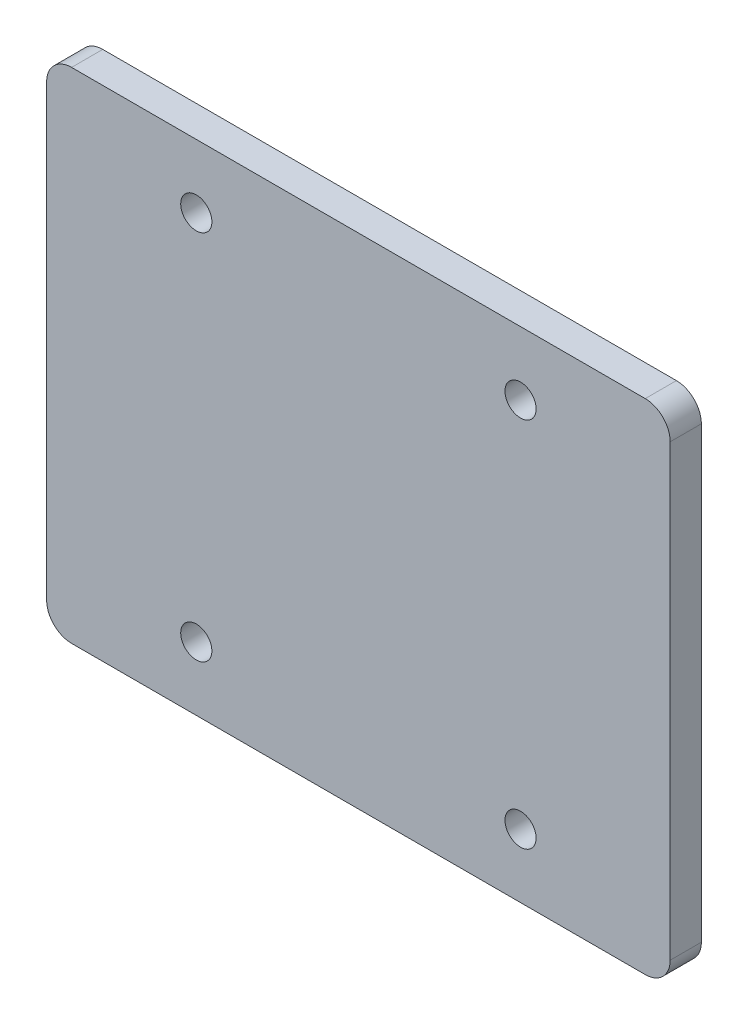
ISO-10303-21;
HEADER;
FILE_DESCRIPTION(('STEP AP214'),'2;1');
FILE_NAME('part.step','',(''),(''),'','','');
FILE_SCHEMA(('AUTOMOTIVE_DESIGN { 1 0 10303 214 1 1 1 1 }'));
ENDSEC;
DATA;
#1=APPLICATION_CONTEXT('core data for automotive mechanical design processes');
#2=APPLICATION_PROTOCOL_DEFINITION('international standard','automotive_design',2000,#1);
#3=PRODUCT_CONTEXT('',#1,'mechanical');
#4=PRODUCT('Part','Part','',(#3));
#5=PRODUCT_RELATED_PRODUCT_CATEGORY('part','',(#4));
#6=PRODUCT_DEFINITION_FORMATION('','',#4);
#7=PRODUCT_DEFINITION_CONTEXT('part definition',#1,'design');
#8=PRODUCT_DEFINITION('design','',#6,#7);
#9=PRODUCT_DEFINITION_SHAPE('','',#8);
#10=(LENGTH_UNIT() NAMED_UNIT(*) SI_UNIT(.MILLI.,.METRE.));
#11=(NAMED_UNIT(*) PLANE_ANGLE_UNIT() SI_UNIT($,.RADIAN.));
#12=(NAMED_UNIT(*) SI_UNIT($,.STERADIAN.) SOLID_ANGLE_UNIT());
#13=UNCERTAINTY_MEASURE_WITH_UNIT(LENGTH_MEASURE(1.E-05),#10,'distance_accuracy_value','');
#14=(GEOMETRIC_REPRESENTATION_CONTEXT(3) GLOBAL_UNCERTAINTY_ASSIGNED_CONTEXT((#13)) GLOBAL_UNIT_ASSIGNED_CONTEXT((#10,
#11,#12)) REPRESENTATION_CONTEXT('',''));
#15=CARTESIAN_POINT('',(0.,0.,0.));
#16=DIRECTION('',(0.,0.,1.));
#17=DIRECTION('',(1.,0.,0.));
#18=AXIS2_PLACEMENT_3D('',#15,#16,#17);
#19=CARTESIAN_POINT('',(0.,0.,3.175));
#20=DIRECTION('',(1.,0.,0.));
#21=DIRECTION('',(0.,1.,0.));
#22=AXIS2_PLACEMENT_3D('',#19,#20,#21);
#23=PLANE('',#22);
#24=DIRECTION('',(0.,-1.,0.));
#25=VECTOR('',#24,1.);
#26=CARTESIAN_POINT('',(0.,0.,0.));
#27=LINE('',#26,#25);
#28=CARTESIAN_POINT('',(0.,48.26,0.));
#29=VERTEX_POINT('',#28);
#30=CARTESIAN_POINT('',(0.,2.54,0.));
#31=VERTEX_POINT('',#30);
#32=EDGE_CURVE('E126',#29,#31,#27,.T.);
#33=ORIENTED_EDGE('',*,*,#32,.T.);
#34=DIRECTION('',(0.,0.,-1.));
#35=VECTOR('',#34,1.);
#36=CARTESIAN_POINT('',(0.,2.54,3.175));
#37=LINE('',#36,#35);
#38=CARTESIAN_POINT('',(0.,2.54,3.175));
#39=VERTEX_POINT('',#38);
#40=EDGE_CURVE('E104',#31,#39,#37,.F.);
#41=ORIENTED_EDGE('',*,*,#40,.T.);
#42=DIRECTION('',(0.,-1.,0.));
#43=VECTOR('',#42,1.);
#44=CARTESIAN_POINT('',(0.,0.,3.175));
#45=LINE('',#44,#43);
#46=CARTESIAN_POINT('',(0.,48.26,3.175));
#47=VERTEX_POINT('',#46);
#48=EDGE_CURVE('E136',#47,#39,#45,.T.);
#49=ORIENTED_EDGE('',*,*,#48,.F.);
#50=DIRECTION('',(0.,0.,-1.));
#51=VECTOR('',#50,1.);
#52=CARTESIAN_POINT('',(0.,48.26,3.175));
#53=LINE('',#52,#51);
#54=EDGE_CURVE('E109',#47,#29,#53,.T.);
#55=ORIENTED_EDGE('',*,*,#54,.T.);
#56=EDGE_LOOP('',(#33,#41,#49,#55));
#57=FACE_BOUND('',#56,.T.);
#58=ADVANCED_FACE('F34',(#57),#23,.F.);
#59=CARTESIAN_POINT('',(0.,0.,3.175));
#60=DIRECTION('',(0.,1.,0.));
#61=DIRECTION('',(0.,0.,1.));
#62=AXIS2_PLACEMENT_3D('',#59,#60,#61);
#63=PLANE('',#62);
#64=DIRECTION('',(1.,0.,0.));
#65=VECTOR('',#64,1.);
#66=CARTESIAN_POINT('',(0.,0.,3.175));
#67=LINE('',#66,#65);
#68=CARTESIAN_POINT('',(2.54,0.,3.175));
#69=VERTEX_POINT('',#68);
#70=CARTESIAN_POINT('',(60.96,0.,3.175));
#71=VERTEX_POINT('',#70);
#72=EDGE_CURVE('E119',#69,#71,#67,.T.);
#73=ORIENTED_EDGE('',*,*,#72,.F.);
#74=DIRECTION('',(0.,0.,-1.));
#75=VECTOR('',#74,1.);
#76=CARTESIAN_POINT('',(2.54,0.,3.175));
#77=LINE('',#76,#75);
#78=CARTESIAN_POINT('',(2.54,0.,0.));
#79=VERTEX_POINT('',#78);
#80=EDGE_CURVE('E103',#69,#79,#77,.T.);
#81=ORIENTED_EDGE('',*,*,#80,.T.);
#82=DIRECTION('',(1.,0.,0.));
#83=VECTOR('',#82,1.);
#84=CARTESIAN_POINT('',(0.,0.,0.));
#85=LINE('',#84,#83);
#86=CARTESIAN_POINT('',(60.96,0.,0.));
#87=VERTEX_POINT('',#86);
#88=EDGE_CURVE('E116',#79,#87,#85,.T.);
#89=ORIENTED_EDGE('',*,*,#88,.T.);
#90=DIRECTION('',(0.,0.,-1.));
#91=VECTOR('',#90,1.);
#92=CARTESIAN_POINT('',(60.96,0.,3.175));
#93=LINE('',#92,#91);
#94=EDGE_CURVE('E121',#87,#71,#93,.F.);
#95=ORIENTED_EDGE('',*,*,#94,.T.);
#96=EDGE_LOOP('',(#73,#81,#89,#95));
#97=FACE_BOUND('',#96,.T.);
#98=ADVANCED_FACE('F115',(#97),#63,.F.);
#99=CARTESIAN_POINT('',(63.5,0.,3.175));
#100=DIRECTION('',(-1.,0.,0.));
#101=DIRECTION('',(0.,-1.,0.));
#102=AXIS2_PLACEMENT_3D('',#99,#100,#101);
#103=PLANE('',#102);
#104=DIRECTION('',(0.,1.,0.));
#105=VECTOR('',#104,1.);
#106=CARTESIAN_POINT('',(63.5,0.,3.175));
#107=LINE('',#106,#105);
#108=CARTESIAN_POINT('',(63.5,2.54,3.175));
#109=VERTEX_POINT('',#108);
#110=CARTESIAN_POINT('',(63.5,48.26,3.175));
#111=VERTEX_POINT('',#110);
#112=EDGE_CURVE('E170',#109,#111,#107,.T.);
#113=ORIENTED_EDGE('',*,*,#112,.F.);
#114=DIRECTION('',(0.,0.,-1.));
#115=VECTOR('',#114,1.);
#116=CARTESIAN_POINT('',(63.5,2.54,3.175));
#117=LINE('',#116,#115);
#118=CARTESIAN_POINT('',(63.5,2.54,0.));
#119=VERTEX_POINT('',#118);
#120=EDGE_CURVE('E155',#109,#119,#117,.T.);
#121=ORIENTED_EDGE('',*,*,#120,.T.);
#122=DIRECTION('',(0.,1.,0.));
#123=VECTOR('',#122,1.);
#124=CARTESIAN_POINT('',(63.5,0.,0.));
#125=LINE('',#124,#123);
#126=CARTESIAN_POINT('',(63.5,48.26,0.));
#127=VERTEX_POINT('',#126);
#128=EDGE_CURVE('E125',#119,#127,#125,.T.);
#129=ORIENTED_EDGE('',*,*,#128,.T.);
#130=DIRECTION('',(0.,0.,-1.));
#131=VECTOR('',#130,1.);
#132=CARTESIAN_POINT('',(63.5,48.26,3.175));
#133=LINE('',#132,#131);
#134=EDGE_CURVE('E153',#127,#111,#133,.F.);
#135=ORIENTED_EDGE('',*,*,#134,.T.);
#136=EDGE_LOOP('',(#113,#121,#129,#135));
#137=FACE_BOUND('',#136,.T.);
#138=ADVANCED_FACE('F185',(#137),#103,.F.);
#139=CARTESIAN_POINT('',(0.,50.8,3.175));
#140=DIRECTION('',(0.,-1.,0.));
#141=DIRECTION('',(0.,0.,-1.));
#142=AXIS2_PLACEMENT_3D('',#139,#140,#141);
#143=PLANE('',#142);
#144=DIRECTION('',(-1.,0.,0.));
#145=VECTOR('',#144,1.);
#146=CARTESIAN_POINT('',(0.,50.8,0.));
#147=LINE('',#146,#145);
#148=CARTESIAN_POINT('',(60.96,50.8,0.));
#149=VERTEX_POINT('',#148);
#150=CARTESIAN_POINT('',(2.53999999999999,50.8,0.));
#151=VERTEX_POINT('',#150);
#152=EDGE_CURVE('E129',#149,#151,#147,.T.);
#153=ORIENTED_EDGE('',*,*,#152,.T.);
#154=DIRECTION('',(0.,0.,-1.));
#155=VECTOR('',#154,1.);
#156=CARTESIAN_POINT('',(2.53999999999999,50.8,3.175));
#157=LINE('',#156,#155);
#158=CARTESIAN_POINT('',(2.53999999999999,50.8,3.175));
#159=VERTEX_POINT('',#158);
#160=EDGE_CURVE('E11',#151,#159,#157,.F.);
#161=ORIENTED_EDGE('',*,*,#160,.T.);
#162=DIRECTION('',(-1.,0.,0.));
#163=VECTOR('',#162,1.);
#164=CARTESIAN_POINT('',(0.,50.8,3.175));
#165=LINE('',#164,#163);
#166=CARTESIAN_POINT('',(60.96,50.8,3.175));
#167=VERTEX_POINT('',#166);
#168=EDGE_CURVE('E137',#167,#159,#165,.T.);
#169=ORIENTED_EDGE('',*,*,#168,.F.);
#170=DIRECTION('',(0.,0.,-1.));
#171=VECTOR('',#170,1.);
#172=CARTESIAN_POINT('',(60.96,50.8,3.175));
#173=LINE('',#172,#171);
#174=EDGE_CURVE('E42',#167,#149,#173,.T.);
#175=ORIENTED_EDGE('',*,*,#174,.T.);
#176=EDGE_LOOP('',(#153,#161,#169,#175));
#177=FACE_BOUND('',#176,.T.);
#178=ADVANCED_FACE('F160',(#177),#143,.F.);
#179=CARTESIAN_POINT('',(0.,0.,3.175));
#180=DIRECTION('',(0.,0.,-1.));
#181=DIRECTION('',(-1.,0.,0.));
#182=AXIS2_PLACEMENT_3D('',#179,#180,#181);
#183=PLANE('',#182);
#184=CARTESIAN_POINT('',(48.26,6.477,3.175));
#185=DIRECTION('',(0.,0.,-1.));
#186=DIRECTION('',(-1.,0.,0.));
#187=AXIS2_PLACEMENT_3D('',#184,#185,#186);
#188=CIRCLE('',#187,1.5875);
#189=CARTESIAN_POINT('',(46.6725,6.477,3.175));
#190=VERTEX_POINT('',#189);
#191=EDGE_CURVE('E301',#190,#190,#188,.T.);
#192=ORIENTED_EDGE('',*,*,#191,.T.);
#193=EDGE_LOOP('',(#192));
#194=FACE_BOUND('',#193,.T.);
#195=CARTESIAN_POINT('',(48.26,44.323,3.175));
#196=DIRECTION('',(0.,0.,-1.));
#197=DIRECTION('',(-1.,0.,0.));
#198=AXIS2_PLACEMENT_3D('',#195,#196,#197);
#199=CIRCLE('',#198,1.5875);
#200=CARTESIAN_POINT('',(46.6725,44.323,3.175));
#201=VERTEX_POINT('',#200);
#202=EDGE_CURVE('E303',#201,#201,#199,.T.);
#203=ORIENTED_EDGE('',*,*,#202,.T.);
#204=EDGE_LOOP('',(#203));
#205=FACE_BOUND('',#204,.T.);
#206=CARTESIAN_POINT('',(15.24,44.323,3.175));
#207=DIRECTION('',(0.,0.,-1.));
#208=DIRECTION('',(-1.,0.,0.));
#209=AXIS2_PLACEMENT_3D('',#206,#207,#208);
#210=CIRCLE('',#209,1.5875);
#211=CARTESIAN_POINT('',(13.6525,44.323,3.175));
#212=VERTEX_POINT('',#211);
#213=EDGE_CURVE('E315',#212,#212,#210,.T.);
#214=ORIENTED_EDGE('',*,*,#213,.T.);
#215=EDGE_LOOP('',(#214));
#216=FACE_BOUND('',#215,.T.);
#217=CARTESIAN_POINT('',(15.24,6.477,3.175));
#218=DIRECTION('',(0.,0.,-1.));
#219=DIRECTION('',(-1.,0.,0.));
#220=AXIS2_PLACEMENT_3D('',#217,#218,#219);
#221=CIRCLE('',#220,1.5875);
#222=CARTESIAN_POINT('',(13.6525,6.477,3.175));
#223=VERTEX_POINT('',#222);
#224=EDGE_CURVE('E308',#223,#223,#221,.T.);
#225=ORIENTED_EDGE('',*,*,#224,.T.);
#226=EDGE_LOOP('',(#225));
#227=FACE_BOUND('',#226,.T.);
#228=ORIENTED_EDGE('',*,*,#48,.T.);
#229=CARTESIAN_POINT('',(2.54,2.54,3.175));
#230=DIRECTION('',(0.,0.,-1.));
#231=DIRECTION('',(-1.,0.,0.));
#232=AXIS2_PLACEMENT_3D('',#229,#230,#231);
#233=CIRCLE('',#232,2.54);
#234=EDGE_CURVE('E151',#39,#69,#233,.F.);
#235=ORIENTED_EDGE('',*,*,#234,.T.);
#236=ORIENTED_EDGE('',*,*,#72,.T.);
#237=CARTESIAN_POINT('',(60.96,2.54,3.175));
#238=DIRECTION('',(0.,0.,-1.));
#239=DIRECTION('',(-1.,0.,0.));
#240=AXIS2_PLACEMENT_3D('',#237,#238,#239);
#241=CIRCLE('',#240,2.54);
#242=EDGE_CURVE('E149',#71,#109,#241,.F.);
#243=ORIENTED_EDGE('',*,*,#242,.T.);
#244=ORIENTED_EDGE('',*,*,#112,.T.);
#245=CARTESIAN_POINT('',(60.96,48.26,3.175));
#246=DIRECTION('',(0.,0.,-1.));
#247=DIRECTION('',(-1.,0.,0.));
#248=AXIS2_PLACEMENT_3D('',#245,#246,#247);
#249=CIRCLE('',#248,2.54);
#250=EDGE_CURVE('E54',#111,#167,#249,.F.);
#251=ORIENTED_EDGE('',*,*,#250,.T.);
#252=ORIENTED_EDGE('',*,*,#168,.T.);
#253=CARTESIAN_POINT('',(2.53999999999999,48.26,3.175));
#254=DIRECTION('',(0.,0.,-1.));
#255=DIRECTION('',(-1.,0.,0.));
#256=AXIS2_PLACEMENT_3D('',#253,#254,#255);
#257=CIRCLE('',#256,2.54);
#258=EDGE_CURVE('E147',#159,#47,#257,.F.);
#259=ORIENTED_EDGE('',*,*,#258,.T.);
#260=EDGE_LOOP('',(#228,#235,#236,#243,#244,#251,#252,#259));
#261=FACE_BOUND('',#260,.T.);
#262=ADVANCED_FACE('F175',(#194,#205,#216,#227,#261),#183,.F.);
#263=CARTESIAN_POINT('',(0.,0.,0.));
#264=DIRECTION('',(0.,0.,-1.));
#265=DIRECTION('',(-1.,0.,0.));
#266=AXIS2_PLACEMENT_3D('',#263,#264,#265);
#267=PLANE('',#266);
#268=CARTESIAN_POINT('',(48.26,6.477,0.));
#269=DIRECTION('',(0.,0.,-1.));
#270=DIRECTION('',(-1.,0.,0.));
#271=AXIS2_PLACEMENT_3D('',#268,#269,#270);
#272=CIRCLE('',#271,1.5875);
#273=CARTESIAN_POINT('',(46.6725,6.477,0.));
#274=VERTEX_POINT('',#273);
#275=EDGE_CURVE('E299',#274,#274,#272,.T.);
#276=ORIENTED_EDGE('',*,*,#275,.F.);
#277=EDGE_LOOP('',(#276));
#278=FACE_BOUND('',#277,.T.);
#279=CARTESIAN_POINT('',(48.26,44.323,0.));
#280=DIRECTION('',(0.,0.,-1.));
#281=DIRECTION('',(-1.,0.,0.));
#282=AXIS2_PLACEMENT_3D('',#279,#280,#281);
#283=CIRCLE('',#282,1.5875);
#284=CARTESIAN_POINT('',(46.6725,44.323,0.));
#285=VERTEX_POINT('',#284);
#286=EDGE_CURVE('E306',#285,#285,#283,.T.);
#287=ORIENTED_EDGE('',*,*,#286,.F.);
#288=EDGE_LOOP('',(#287));
#289=FACE_BOUND('',#288,.T.);
#290=CARTESIAN_POINT('',(15.24,44.323,0.));
#291=DIRECTION('',(0.,0.,-1.));
#292=DIRECTION('',(-1.,0.,0.));
#293=AXIS2_PLACEMENT_3D('',#290,#291,#292);
#294=CIRCLE('',#293,1.5875);
#295=CARTESIAN_POINT('',(13.6525,44.323,0.));
#296=VERTEX_POINT('',#295);
#297=EDGE_CURVE('E310',#296,#296,#294,.T.);
#298=ORIENTED_EDGE('',*,*,#297,.F.);
#299=EDGE_LOOP('',(#298));
#300=FACE_BOUND('',#299,.T.);
#301=CARTESIAN_POINT('',(15.24,6.477,0.));
#302=DIRECTION('',(0.,0.,-1.));
#303=DIRECTION('',(-1.,0.,0.));
#304=AXIS2_PLACEMENT_3D('',#301,#302,#303);
#305=CIRCLE('',#304,1.5875);
#306=CARTESIAN_POINT('',(13.6525,6.477,0.));
#307=VERTEX_POINT('',#306);
#308=EDGE_CURVE('E131',#307,#307,#305,.T.);
#309=ORIENTED_EDGE('',*,*,#308,.F.);
#310=EDGE_LOOP('',(#309));
#311=FACE_BOUND('',#310,.T.);
#312=ORIENTED_EDGE('',*,*,#88,.F.);
#313=CARTESIAN_POINT('',(2.54,2.54,0.));
#314=DIRECTION('',(0.,0.,-1.));
#315=DIRECTION('',(-1.,0.,0.));
#316=AXIS2_PLACEMENT_3D('',#313,#314,#315);
#317=CIRCLE('',#316,2.54);
#318=EDGE_CURVE('E99',#79,#31,#317,.T.);
#319=ORIENTED_EDGE('',*,*,#318,.T.);
#320=ORIENTED_EDGE('',*,*,#32,.F.);
#321=CARTESIAN_POINT('',(2.53999999999999,48.26,0.));
#322=DIRECTION('',(0.,0.,-1.));
#323=DIRECTION('',(-1.,0.,0.));
#324=AXIS2_PLACEMENT_3D('',#321,#322,#323);
#325=CIRCLE('',#324,2.54);
#326=EDGE_CURVE('E140',#29,#151,#325,.T.);
#327=ORIENTED_EDGE('',*,*,#326,.T.);
#328=ORIENTED_EDGE('',*,*,#152,.F.);
#329=CARTESIAN_POINT('',(60.96,48.26,0.));
#330=DIRECTION('',(0.,0.,-1.));
#331=DIRECTION('',(-1.,0.,0.));
#332=AXIS2_PLACEMENT_3D('',#329,#330,#331);
#333=CIRCLE('',#332,2.54);
#334=EDGE_CURVE('E120',#149,#127,#333,.T.);
#335=ORIENTED_EDGE('',*,*,#334,.T.);
#336=ORIENTED_EDGE('',*,*,#128,.F.);
#337=CARTESIAN_POINT('',(60.96,2.54,0.));
#338=DIRECTION('',(0.,0.,-1.));
#339=DIRECTION('',(-1.,0.,0.));
#340=AXIS2_PLACEMENT_3D('',#337,#338,#339);
#341=CIRCLE('',#340,2.54);
#342=EDGE_CURVE('E110',#119,#87,#341,.T.);
#343=ORIENTED_EDGE('',*,*,#342,.T.);
#344=EDGE_LOOP('',(#312,#319,#320,#327,#328,#335,#336,#343));
#345=FACE_BOUND('',#344,.T.);
#346=ADVANCED_FACE('F123',(#278,#289,#300,#311,#345),#267,.T.);
#347=CARTESIAN_POINT('',(2.54,2.54,3.175));
#348=DIRECTION('',(0.,0.,-1.));
#349=DIRECTION('',(-1.,0.,0.));
#350=AXIS2_PLACEMENT_3D('',#347,#348,#349);
#351=CYLINDRICAL_SURFACE('',#350,2.54);
#352=ORIENTED_EDGE('',*,*,#234,.F.);
#353=ORIENTED_EDGE('',*,*,#40,.F.);
#354=ORIENTED_EDGE('',*,*,#318,.F.);
#355=ORIENTED_EDGE('',*,*,#80,.F.);
#356=EDGE_LOOP('',(#352,#353,#354,#355));
#357=FACE_BOUND('',#356,.T.);
#358=ADVANCED_FACE('F102',(#357),#351,.T.);
#359=CARTESIAN_POINT('',(60.96,2.54,3.175));
#360=DIRECTION('',(0.,0.,-1.));
#361=DIRECTION('',(-1.,0.,0.));
#362=AXIS2_PLACEMENT_3D('',#359,#360,#361);
#363=CYLINDRICAL_SURFACE('',#362,2.54);
#364=ORIENTED_EDGE('',*,*,#242,.F.);
#365=ORIENTED_EDGE('',*,*,#94,.F.);
#366=ORIENTED_EDGE('',*,*,#342,.F.);
#367=ORIENTED_EDGE('',*,*,#120,.F.);
#368=EDGE_LOOP('',(#364,#365,#366,#367));
#369=FACE_BOUND('',#368,.T.);
#370=ADVANCED_FACE('F200',(#369),#363,.T.);
#371=CARTESIAN_POINT('',(2.53999999999999,48.26,3.175));
#372=DIRECTION('',(0.,0.,-1.));
#373=DIRECTION('',(-1.,0.,0.));
#374=AXIS2_PLACEMENT_3D('',#371,#372,#373);
#375=CYLINDRICAL_SURFACE('',#374,2.54);
#376=ORIENTED_EDGE('',*,*,#258,.F.);
#377=ORIENTED_EDGE('',*,*,#160,.F.);
#378=ORIENTED_EDGE('',*,*,#326,.F.);
#379=ORIENTED_EDGE('',*,*,#54,.F.);
#380=EDGE_LOOP('',(#376,#377,#378,#379));
#381=FACE_BOUND('',#380,.T.);
#382=ADVANCED_FACE('F165',(#381),#375,.T.);
#383=CARTESIAN_POINT('',(60.96,48.26,3.175));
#384=DIRECTION('',(0.,0.,-1.));
#385=DIRECTION('',(-1.,0.,0.));
#386=AXIS2_PLACEMENT_3D('',#383,#384,#385);
#387=CYLINDRICAL_SURFACE('',#386,2.54);
#388=ORIENTED_EDGE('',*,*,#250,.F.);
#389=ORIENTED_EDGE('',*,*,#134,.F.);
#390=ORIENTED_EDGE('',*,*,#334,.F.);
#391=ORIENTED_EDGE('',*,*,#174,.F.);
#392=EDGE_LOOP('',(#388,#389,#390,#391));
#393=FACE_BOUND('',#392,.T.);
#394=ADVANCED_FACE('F36',(#393),#387,.T.);
#395=CARTESIAN_POINT('',(15.24,6.477,-0.00100000000000013));
#396=DIRECTION('',(0.,0.,1.));
#397=DIRECTION('',(1.,0.,0.));
#398=AXIS2_PLACEMENT_3D('',#395,#396,#397);
#399=CYLINDRICAL_SURFACE('',#398,1.5875);
#400=ORIENTED_EDGE('',*,*,#308,.T.);
#401=EDGE_LOOP('',(#400));
#402=FACE_BOUND('',#401,.T.);
#403=ORIENTED_EDGE('',*,*,#224,.F.);
#404=EDGE_LOOP('',(#403));
#405=FACE_BOUND('',#404,.T.);
#406=ADVANCED_FACE('F207',(#402,#405),#399,.F.);
#407=CARTESIAN_POINT('',(15.24,44.323,-0.00100000000000013));
#408=DIRECTION('',(0.,0.,1.));
#409=DIRECTION('',(1.,0.,0.));
#410=AXIS2_PLACEMENT_3D('',#407,#408,#409);
#411=CYLINDRICAL_SURFACE('',#410,1.5875);
#412=ORIENTED_EDGE('',*,*,#297,.T.);
#413=EDGE_LOOP('',(#412));
#414=FACE_BOUND('',#413,.T.);
#415=ORIENTED_EDGE('',*,*,#213,.F.);
#416=EDGE_LOOP('',(#415));
#417=FACE_BOUND('',#416,.T.);
#418=ADVANCED_FACE('F211',(#414,#417),#411,.F.);
#419=CARTESIAN_POINT('',(48.26,44.323,-0.00100000000000013));
#420=DIRECTION('',(0.,0.,1.));
#421=DIRECTION('',(1.,0.,0.));
#422=AXIS2_PLACEMENT_3D('',#419,#420,#421);
#423=CYLINDRICAL_SURFACE('',#422,1.5875);
#424=ORIENTED_EDGE('',*,*,#286,.T.);
#425=EDGE_LOOP('',(#424));
#426=FACE_BOUND('',#425,.T.);
#427=ORIENTED_EDGE('',*,*,#202,.F.);
#428=EDGE_LOOP('',(#427));
#429=FACE_BOUND('',#428,.T.);
#430=ADVANCED_FACE('F272',(#426,#429),#423,.F.);
#431=CARTESIAN_POINT('',(48.26,6.477,-0.00100000000000013));
#432=DIRECTION('',(0.,0.,1.));
#433=DIRECTION('',(1.,0.,0.));
#434=AXIS2_PLACEMENT_3D('',#431,#432,#433);
#435=CYLINDRICAL_SURFACE('',#434,1.5875);
#436=ORIENTED_EDGE('',*,*,#275,.T.);
#437=EDGE_LOOP('',(#436));
#438=FACE_BOUND('',#437,.T.);
#439=ORIENTED_EDGE('',*,*,#191,.F.);
#440=EDGE_LOOP('',(#439));
#441=FACE_BOUND('',#440,.T.);
#442=ADVANCED_FACE('F282',(#438,#441),#435,.F.);
#443=CLOSED_SHELL('',(#58,#98,#138,#178,#262,#346,#358,#370,#382,#394,#406,#418,#430,#442));
#444=MANIFOLD_SOLID_BREP('B2',#443);
#445=ADVANCED_BREP_SHAPE_REPRESENTATION('',(#18,#444),#14);
#446=SHAPE_DEFINITION_REPRESENTATION(#9,#445);
ENDSEC;
END-ISO-10303-21;
